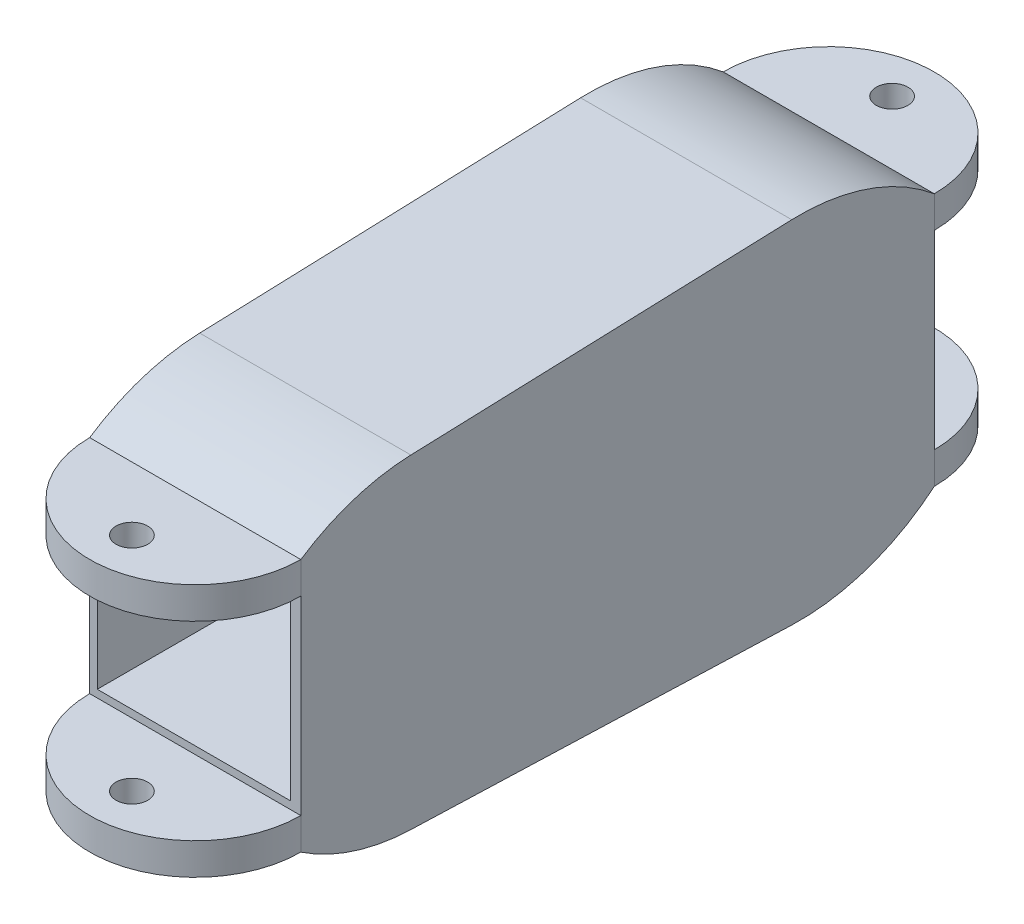
ISO-10303-21;
HEADER;
FILE_DESCRIPTION(('STEP AP214'),'2;1');
FILE_NAME('part.step','',(''),(''),'','','');
FILE_SCHEMA(('AUTOMOTIVE_DESIGN { 1 0 10303 214 1 1 1 1 }'));
ENDSEC;
DATA;
#1=APPLICATION_CONTEXT('core data for automotive mechanical design processes');
#2=APPLICATION_PROTOCOL_DEFINITION('international standard','automotive_design',2000,#1);
#3=PRODUCT_CONTEXT('',#1,'mechanical');
#4=PRODUCT('Part','Part','',(#3));
#5=PRODUCT_RELATED_PRODUCT_CATEGORY('part','',(#4));
#6=PRODUCT_DEFINITION_FORMATION('','',#4);
#7=PRODUCT_DEFINITION_CONTEXT('part definition',#1,'design');
#8=PRODUCT_DEFINITION('design','',#6,#7);
#9=PRODUCT_DEFINITION_SHAPE('','',#8);
#10=(LENGTH_UNIT() NAMED_UNIT(*) SI_UNIT(.MILLI.,.METRE.));
#11=(NAMED_UNIT(*) PLANE_ANGLE_UNIT() SI_UNIT($,.RADIAN.));
#12=(NAMED_UNIT(*) SI_UNIT($,.STERADIAN.) SOLID_ANGLE_UNIT());
#13=UNCERTAINTY_MEASURE_WITH_UNIT(LENGTH_MEASURE(1.E-05),#10,'distance_accuracy_value','');
#14=(GEOMETRIC_REPRESENTATION_CONTEXT(3) GLOBAL_UNCERTAINTY_ASSIGNED_CONTEXT((#13)) GLOBAL_UNIT_ASSIGNED_CONTEXT((#10,
#11,#12)) REPRESENTATION_CONTEXT('',''));
#15=CARTESIAN_POINT('',(0.,0.,0.));
#16=DIRECTION('',(0.,0.,1.));
#17=DIRECTION('',(1.,0.,0.));
#18=AXIS2_PLACEMENT_3D('',#15,#16,#17);
#19=CARTESIAN_POINT('',(0.,-6.,-15.));
#20=DIRECTION('',(0.,-1.,0.));
#21=DIRECTION('',(0.,0.,-1.));
#22=AXIS2_PLACEMENT_3D('',#19,#20,#21);
#23=PLANE('',#22);
#24=CARTESIAN_POINT('',(5.,-6.,18.));
#25=DIRECTION('',(0.,-1.,0.));
#26=DIRECTION('',(0.,0.,-1.));
#27=AXIS2_PLACEMENT_3D('',#24,#25,#26);
#28=CIRCLE('',#27,0.75);
#29=CARTESIAN_POINT('',(5.,-6.,17.25));
#30=VERTEX_POINT('',#29);
#31=EDGE_CURVE('E268',#30,#30,#28,.F.);
#32=ORIENTED_EDGE('',*,*,#31,.T.);
#33=EDGE_LOOP('',(#32));
#34=FACE_BOUND('',#33,.T.);
#35=DIRECTION('',(-1.,0.,0.));
#36=VECTOR('',#35,1.);
#37=CARTESIAN_POINT('',(0.,-6.,15.));
#38=LINE('',#37,#36);
#39=CARTESIAN_POINT('',(0.,-6.,15.));
#40=VERTEX_POINT('',#39);
#41=CARTESIAN_POINT('',(10.,-6.,15.));
#42=VERTEX_POINT('',#41);
#43=EDGE_CURVE('E266',#40,#42,#38,.F.);
#44=ORIENTED_EDGE('',*,*,#43,.T.);
#45=CARTESIAN_POINT('',(5.,-6.,15.));
#46=DIRECTION('',(0.,-1.,0.));
#47=DIRECTION('',(0.,0.,-1.));
#48=AXIS2_PLACEMENT_3D('',#45,#46,#47);
#49=CIRCLE('',#48,5.);
#50=EDGE_CURVE('E276',#40,#42,#49,.F.);
#51=ORIENTED_EDGE('',*,*,#50,.F.);
#52=EDGE_LOOP('',(#44,#51));
#53=FACE_BOUND('',#52,.T.);
#54=ADVANCED_FACE('F35',(#34,#53),#23,.T.);
#55=CARTESIAN_POINT('',(5.,-1.17017506795E-11,-15.));
#56=DIRECTION('',(0.,1.,0.));
#57=DIRECTION('',(0.,0.,1.));
#58=AXIS2_PLACEMENT_3D('',#55,#56,#57);
#59=CYLINDRICAL_SURFACE('',#58,5.);
#60=CARTESIAN_POINT('',(5.,-6.,-15.));
#61=DIRECTION('',(0.,1.,0.));
#62=DIRECTION('',(0.,0.,1.));
#63=AXIS2_PLACEMENT_3D('',#60,#61,#62);
#64=CIRCLE('',#63,5.);
#65=CARTESIAN_POINT('',(0.,-6.,-15.));
#66=VERTEX_POINT('',#65);
#67=CARTESIAN_POINT('',(10.,-6.,-15.));
#68=VERTEX_POINT('',#67);
#69=EDGE_CURVE('E282',#66,#68,#64,.F.);
#70=ORIENTED_EDGE('',*,*,#69,.F.);
#71=DIRECTION('',(0.,1.,0.));
#72=VECTOR('',#71,1.);
#73=CARTESIAN_POINT('',(0.,-1.17017506795E-11,-15.));
#74=LINE('',#73,#72);
#75=CARTESIAN_POINT('',(0.,-4.5,-15.));
#76=VERTEX_POINT('',#75);
#77=EDGE_CURVE('E289',#66,#76,#74,.T.);
#78=ORIENTED_EDGE('',*,*,#77,.T.);
#79=CARTESIAN_POINT('',(5.,-4.5,-15.));
#80=DIRECTION('',(0.,1.,0.));
#81=DIRECTION('',(0.,0.,1.));
#82=AXIS2_PLACEMENT_3D('',#79,#80,#81);
#83=CIRCLE('',#82,5.);
#84=CARTESIAN_POINT('',(10.,-4.5,-15.));
#85=VERTEX_POINT('',#84);
#86=EDGE_CURVE('E435',#85,#76,#83,.T.);
#87=ORIENTED_EDGE('',*,*,#86,.F.);
#88=DIRECTION('',(0.,1.,0.));
#89=VECTOR('',#88,1.);
#90=CARTESIAN_POINT('',(10.,5.39301936442E-12,-15.));
#91=LINE('',#90,#89);
#92=EDGE_CURVE('E183',#85,#68,#91,.F.);
#93=ORIENTED_EDGE('',*,*,#92,.T.);
#94=EDGE_LOOP('',(#70,#78,#87,#93));
#95=FACE_BOUND('',#94,.T.);
#96=ADVANCED_FACE('F398',(#95),#59,.T.);
#97=CARTESIAN_POINT('',(5.,4.,-18.));
#98=DIRECTION('',(0.,-1.,0.));
#99=DIRECTION('',(0.,0.,-1.));
#100=AXIS2_PLACEMENT_3D('',#97,#98,#99);
#101=CYLINDRICAL_SURFACE('',#100,0.75);
#102=CARTESIAN_POINT('',(5.,-6.,-18.));
#103=DIRECTION('',(0.,-1.,0.));
#104=DIRECTION('',(0.,0.,-1.));
#105=AXIS2_PLACEMENT_3D('',#102,#103,#104);
#106=CIRCLE('',#105,0.75);
#107=CARTESIAN_POINT('',(5.,-6.,-18.75));
#108=VERTEX_POINT('',#107);
#109=EDGE_CURVE('E438',#108,#108,#106,.F.);
#110=ORIENTED_EDGE('',*,*,#109,.F.);
#111=EDGE_LOOP('',(#110));
#112=FACE_BOUND('',#111,.T.);
#113=CARTESIAN_POINT('',(5.,-4.5,-18.));
#114=DIRECTION('',(0.,-1.,0.));
#115=DIRECTION('',(0.,0.,-1.));
#116=AXIS2_PLACEMENT_3D('',#113,#114,#115);
#117=CIRCLE('',#116,0.75);
#118=CARTESIAN_POINT('',(5.,-4.5,-18.75));
#119=VERTEX_POINT('',#118);
#120=EDGE_CURVE('E349',#119,#119,#117,.T.);
#121=ORIENTED_EDGE('',*,*,#120,.F.);
#122=EDGE_LOOP('',(#121));
#123=FACE_BOUND('',#122,.T.);
#124=ADVANCED_FACE('F395',(#112,#123),#101,.F.);
#125=CARTESIAN_POINT('',(5.,-1.17017506795E-11,-15.));
#126=DIRECTION('',(0.,1.,0.));
#127=DIRECTION('',(0.,0.,1.));
#128=AXIS2_PLACEMENT_3D('',#125,#126,#127);
#129=CYLINDRICAL_SURFACE('',#128,5.);
#130=CARTESIAN_POINT('',(5.,4.5,-15.));
#131=DIRECTION('',(0.,1.,0.));
#132=DIRECTION('',(0.,0.,1.));
#133=AXIS2_PLACEMENT_3D('',#130,#131,#132);
#134=CIRCLE('',#133,5.);
#135=CARTESIAN_POINT('',(10.,4.5,-15.));
#136=VERTEX_POINT('',#135);
#137=CARTESIAN_POINT('',(0.,4.5,-15.));
#138=VERTEX_POINT('',#137);
#139=EDGE_CURVE('E344',#136,#138,#134,.T.);
#140=ORIENTED_EDGE('',*,*,#139,.T.);
#141=DIRECTION('',(0.,1.,0.));
#142=VECTOR('',#141,1.);
#143=CARTESIAN_POINT('',(0.,-1.17017506795E-11,-15.));
#144=LINE('',#143,#142);
#145=CARTESIAN_POINT('',(0.,6.,-15.));
#146=VERTEX_POINT('',#145);
#147=EDGE_CURVE('E283',#138,#146,#144,.T.);
#148=ORIENTED_EDGE('',*,*,#147,.T.);
#149=CARTESIAN_POINT('',(5.,6.,-15.));
#150=DIRECTION('',(0.,1.,0.));
#151=DIRECTION('',(0.,0.,1.));
#152=AXIS2_PLACEMENT_3D('',#149,#150,#151);
#153=CIRCLE('',#152,5.);
#154=CARTESIAN_POINT('',(10.,6.,-15.));
#155=VERTEX_POINT('',#154);
#156=EDGE_CURVE('E425',#146,#155,#153,.F.);
#157=ORIENTED_EDGE('',*,*,#156,.T.);
#158=DIRECTION('',(0.,1.,0.));
#159=VECTOR('',#158,1.);
#160=CARTESIAN_POINT('',(10.,5.39301936442E-12,-15.));
#161=LINE('',#160,#159);
#162=EDGE_CURVE('E286',#155,#136,#161,.F.);
#163=ORIENTED_EDGE('',*,*,#162,.T.);
#164=EDGE_LOOP('',(#140,#148,#157,#163));
#165=FACE_BOUND('',#164,.T.);
#166=ADVANCED_FACE('F345',(#165),#129,.T.);
#167=CARTESIAN_POINT('',(5.,4.,-18.));
#168=DIRECTION('',(0.,-1.,0.));
#169=DIRECTION('',(0.,0.,-1.));
#170=AXIS2_PLACEMENT_3D('',#167,#168,#169);
#171=CYLINDRICAL_SURFACE('',#170,0.75);
#172=CARTESIAN_POINT('',(5.,6.,-18.));
#173=DIRECTION('',(0.,-1.,0.));
#174=DIRECTION('',(0.,0.,-1.));
#175=AXIS2_PLACEMENT_3D('',#172,#173,#174);
#176=CIRCLE('',#175,0.75);
#177=CARTESIAN_POINT('',(5.,6.,-18.75));
#178=VERTEX_POINT('',#177);
#179=EDGE_CURVE('E279',#178,#178,#176,.F.);
#180=ORIENTED_EDGE('',*,*,#179,.T.);
#181=EDGE_LOOP('',(#180));
#182=FACE_BOUND('',#181,.T.);
#183=CARTESIAN_POINT('',(5.,4.5,-18.));
#184=DIRECTION('',(0.,-1.,0.));
#185=DIRECTION('',(0.,0.,-1.));
#186=AXIS2_PLACEMENT_3D('',#183,#184,#185);
#187=CIRCLE('',#186,0.75);
#188=CARTESIAN_POINT('',(5.,4.5,-18.75));
#189=VERTEX_POINT('',#188);
#190=EDGE_CURVE('E348',#189,#189,#187,.T.);
#191=ORIENTED_EDGE('',*,*,#190,.T.);
#192=EDGE_LOOP('',(#191));
#193=FACE_BOUND('',#192,.T.);
#194=ADVANCED_FACE('F388',(#182,#193),#171,.F.);
#195=CARTESIAN_POINT('',(0.,6.,-15.));
#196=DIRECTION('',(0.,-1.,0.));
#197=DIRECTION('',(0.,0.,-1.));
#198=AXIS2_PLACEMENT_3D('',#195,#196,#197);
#199=PLANE('',#198);
#200=CARTESIAN_POINT('',(5.,6.,18.));
#201=DIRECTION('',(0.,-1.,0.));
#202=DIRECTION('',(0.,0.,-1.));
#203=AXIS2_PLACEMENT_3D('',#200,#201,#202);
#204=CIRCLE('',#203,0.75);
#205=CARTESIAN_POINT('',(5.,6.,17.25));
#206=VERTEX_POINT('',#205);
#207=EDGE_CURVE('E262',#206,#206,#204,.T.);
#208=ORIENTED_EDGE('',*,*,#207,.T.);
#209=EDGE_LOOP('',(#208));
#210=FACE_BOUND('',#209,.T.);
#211=CARTESIAN_POINT('',(5.,6.,15.));
#212=DIRECTION('',(0.,-1.,0.));
#213=DIRECTION('',(0.,0.,-1.));
#214=AXIS2_PLACEMENT_3D('',#211,#212,#213);
#215=CIRCLE('',#214,5.);
#216=CARTESIAN_POINT('',(10.,6.,15.));
#217=VERTEX_POINT('',#216);
#218=CARTESIAN_POINT('',(0.,6.,15.));
#219=VERTEX_POINT('',#218);
#220=EDGE_CURVE('E263',#217,#219,#215,.T.);
#221=ORIENTED_EDGE('',*,*,#220,.F.);
#222=DIRECTION('',(-1.,0.,0.));
#223=VECTOR('',#222,1.);
#224=CARTESIAN_POINT('',(0.,6.,15.));
#225=LINE('',#224,#223);
#226=EDGE_CURVE('E215',#217,#219,#225,.T.);
#227=ORIENTED_EDGE('',*,*,#226,.T.);
#228=EDGE_LOOP('',(#221,#227));
#229=FACE_BOUND('',#228,.T.);
#230=ADVANCED_FACE('F385',(#210,#229),#199,.F.);
#231=CARTESIAN_POINT('',(5.,-1.17017506795E-11,15.));
#232=DIRECTION('',(0.,-1.,0.));
#233=DIRECTION('',(0.,0.,-1.));
#234=AXIS2_PLACEMENT_3D('',#231,#232,#233);
#235=CYLINDRICAL_SURFACE('',#234,5.);
#236=CARTESIAN_POINT('',(5.,-4.5,15.));
#237=DIRECTION('',(0.,-1.,0.));
#238=DIRECTION('',(0.,0.,-1.));
#239=AXIS2_PLACEMENT_3D('',#236,#237,#238);
#240=CIRCLE('',#239,5.);
#241=CARTESIAN_POINT('',(0.,-4.5,15.));
#242=VERTEX_POINT('',#241);
#243=CARTESIAN_POINT('',(10.,-4.5,15.));
#244=VERTEX_POINT('',#243);
#245=EDGE_CURVE('E212',#242,#244,#240,.F.);
#246=ORIENTED_EDGE('',*,*,#245,.F.);
#247=DIRECTION('',(0.,-1.,0.));
#248=VECTOR('',#247,1.);
#249=CARTESIAN_POINT('',(0.,-1.17017506795E-11,15.));
#250=LINE('',#249,#248);
#251=EDGE_CURVE('E273',#242,#40,#250,.T.);
#252=ORIENTED_EDGE('',*,*,#251,.T.);
#253=ORIENTED_EDGE('',*,*,#50,.T.);
#254=DIRECTION('',(0.,1.,0.));
#255=VECTOR('',#254,1.);
#256=CARTESIAN_POINT('',(10.,0.,15.));
#257=LINE('',#256,#255);
#258=EDGE_CURVE('E213',#244,#42,#257,.F.);
#259=ORIENTED_EDGE('',*,*,#258,.F.);
#260=EDGE_LOOP('',(#246,#252,#253,#259));
#261=FACE_BOUND('',#260,.T.);
#262=ADVANCED_FACE('F312',(#261),#235,.T.);
#263=CARTESIAN_POINT('',(5.,4.,18.));
#264=DIRECTION('',(0.,-1.,0.));
#265=DIRECTION('',(0.,0.,-1.));
#266=AXIS2_PLACEMENT_3D('',#263,#264,#265);
#267=CYLINDRICAL_SURFACE('',#266,0.75);
#268=ORIENTED_EDGE('',*,*,#31,.F.);
#269=EDGE_LOOP('',(#268));
#270=FACE_BOUND('',#269,.T.);
#271=CARTESIAN_POINT('',(5.,-4.5,18.));
#272=DIRECTION('',(0.,-1.,0.));
#273=DIRECTION('',(0.,0.,-1.));
#274=AXIS2_PLACEMENT_3D('',#271,#272,#273);
#275=CIRCLE('',#274,0.75);
#276=CARTESIAN_POINT('',(5.,-4.5,17.25));
#277=VERTEX_POINT('',#276);
#278=EDGE_CURVE('E706',#277,#277,#275,.T.);
#279=ORIENTED_EDGE('',*,*,#278,.F.);
#280=EDGE_LOOP('',(#279));
#281=FACE_BOUND('',#280,.T.);
#282=ADVANCED_FACE('F379',(#270,#281),#267,.F.);
#283=CARTESIAN_POINT('',(5.,-1.17017506795E-11,15.));
#284=DIRECTION('',(0.,-1.,0.));
#285=DIRECTION('',(0.,0.,-1.));
#286=AXIS2_PLACEMENT_3D('',#283,#284,#285);
#287=CYLINDRICAL_SURFACE('',#286,5.);
#288=ORIENTED_EDGE('',*,*,#220,.T.);
#289=DIRECTION('',(0.,-1.,0.));
#290=VECTOR('',#289,1.);
#291=CARTESIAN_POINT('',(0.,-1.17017506795E-11,15.));
#292=LINE('',#291,#290);
#293=CARTESIAN_POINT('',(0.,4.5,15.));
#294=VERTEX_POINT('',#293);
#295=EDGE_CURVE('E257',#219,#294,#292,.T.);
#296=ORIENTED_EDGE('',*,*,#295,.T.);
#297=CARTESIAN_POINT('',(5.,4.5,15.));
#298=DIRECTION('',(0.,-1.,0.));
#299=DIRECTION('',(0.,0.,-1.));
#300=AXIS2_PLACEMENT_3D('',#297,#298,#299);
#301=CIRCLE('',#300,5.);
#302=CARTESIAN_POINT('',(10.,4.5,15.));
#303=VERTEX_POINT('',#302);
#304=EDGE_CURVE('E711',#294,#303,#301,.F.);
#305=ORIENTED_EDGE('',*,*,#304,.T.);
#306=DIRECTION('',(0.,1.,0.));
#307=VECTOR('',#306,1.);
#308=CARTESIAN_POINT('',(10.,0.,15.));
#309=LINE('',#308,#307);
#310=EDGE_CURVE('E209',#217,#303,#309,.F.);
#311=ORIENTED_EDGE('',*,*,#310,.F.);
#312=EDGE_LOOP('',(#288,#296,#305,#311));
#313=FACE_BOUND('',#312,.T.);
#314=ADVANCED_FACE('F375',(#313),#287,.T.);
#315=CARTESIAN_POINT('',(5.,4.,18.));
#316=DIRECTION('',(0.,-1.,0.));
#317=DIRECTION('',(0.,0.,-1.));
#318=AXIS2_PLACEMENT_3D('',#315,#316,#317);
#319=CYLINDRICAL_SURFACE('',#318,0.75);
#320=ORIENTED_EDGE('',*,*,#207,.F.);
#321=EDGE_LOOP('',(#320));
#322=FACE_BOUND('',#321,.T.);
#323=CARTESIAN_POINT('',(5.,4.5,18.));
#324=DIRECTION('',(0.,-1.,0.));
#325=DIRECTION('',(0.,0.,-1.));
#326=AXIS2_PLACEMENT_3D('',#323,#324,#325);
#327=CIRCLE('',#326,0.75);
#328=CARTESIAN_POINT('',(5.,4.5,17.25));
#329=VERTEX_POINT('',#328);
#330=EDGE_CURVE('E194',#329,#329,#327,.T.);
#331=ORIENTED_EDGE('',*,*,#330,.T.);
#332=EDGE_LOOP('',(#331));
#333=FACE_BOUND('',#332,.T.);
#334=ADVANCED_FACE('F371',(#322,#333),#319,.F.);
#335=CARTESIAN_POINT('',(0.,-6.,-15.));
#336=DIRECTION('',(0.,-1.,0.));
#337=DIRECTION('',(0.,0.,-1.));
#338=AXIS2_PLACEMENT_3D('',#335,#336,#337);
#339=PLANE('',#338);
#340=ORIENTED_EDGE('',*,*,#109,.T.);
#341=EDGE_LOOP('',(#340));
#342=FACE_BOUND('',#341,.T.);
#343=DIRECTION('',(-1.,0.,0.));
#344=VECTOR('',#343,1.);
#345=CARTESIAN_POINT('',(0.,-6.,-15.));
#346=LINE('',#345,#344);
#347=EDGE_CURVE('E193',#66,#68,#346,.F.);
#348=ORIENTED_EDGE('',*,*,#347,.F.);
#349=ORIENTED_EDGE('',*,*,#69,.T.);
#350=EDGE_LOOP('',(#348,#349));
#351=FACE_BOUND('',#350,.T.);
#352=ADVANCED_FACE('F363',(#342,#351),#339,.T.);
#353=CARTESIAN_POINT('',(0.,-4.5,-20.));
#354=DIRECTION('',(0.,1.,0.));
#355=DIRECTION('',(0.,0.,1.));
#356=AXIS2_PLACEMENT_3D('',#353,#354,#355);
#357=PLANE('',#356);
#358=ORIENTED_EDGE('',*,*,#120,.T.);
#359=EDGE_LOOP('',(#358));
#360=FACE_BOUND('',#359,.T.);
#361=DIRECTION('',(-1.,0.,0.));
#362=VECTOR('',#361,1.);
#363=CARTESIAN_POINT('',(0.,-4.5,-15.));
#364=LINE('',#363,#362);
#365=EDGE_CURVE('E328',#85,#76,#364,.T.);
#366=ORIENTED_EDGE('',*,*,#365,.F.);
#367=ORIENTED_EDGE('',*,*,#86,.T.);
#368=EDGE_LOOP('',(#366,#367));
#369=FACE_BOUND('',#368,.T.);
#370=ADVANCED_FACE('F354',(#360,#369),#357,.T.);
#371=CARTESIAN_POINT('',(0.,4.5,-20.));
#372=DIRECTION('',(0.,1.,0.));
#373=DIRECTION('',(0.,0.,1.));
#374=AXIS2_PLACEMENT_3D('',#371,#372,#373);
#375=PLANE('',#374);
#376=ORIENTED_EDGE('',*,*,#190,.F.);
#377=EDGE_LOOP('',(#376));
#378=FACE_BOUND('',#377,.T.);
#379=ORIENTED_EDGE('',*,*,#139,.F.);
#380=DIRECTION('',(-1.,0.,0.));
#381=VECTOR('',#380,1.);
#382=CARTESIAN_POINT('',(0.,4.5,-15.));
#383=LINE('',#382,#381);
#384=EDGE_CURVE('E222',#138,#136,#383,.F.);
#385=ORIENTED_EDGE('',*,*,#384,.F.);
#386=EDGE_LOOP('',(#379,#385));
#387=FACE_BOUND('',#386,.T.);
#388=ADVANCED_FACE('F351',(#378,#387),#375,.F.);
#389=CARTESIAN_POINT('',(0.,6.,-15.));
#390=DIRECTION('',(0.,-1.,0.));
#391=DIRECTION('',(0.,0.,-1.));
#392=AXIS2_PLACEMENT_3D('',#389,#390,#391);
#393=PLANE('',#392);
#394=ORIENTED_EDGE('',*,*,#179,.F.);
#395=EDGE_LOOP('',(#394));
#396=FACE_BOUND('',#395,.T.);
#397=DIRECTION('',(-1.,0.,0.));
#398=VECTOR('',#397,1.);
#399=CARTESIAN_POINT('',(0.,6.,-15.));
#400=LINE('',#399,#398);
#401=EDGE_CURVE('E216',#155,#146,#400,.T.);
#402=ORIENTED_EDGE('',*,*,#401,.F.);
#403=ORIENTED_EDGE('',*,*,#156,.F.);
#404=EDGE_LOOP('',(#402,#403));
#405=FACE_BOUND('',#404,.T.);
#406=ADVANCED_FACE('F353',(#396,#405),#393,.F.);
#407=CARTESIAN_POINT('',(10.,0.,0.));
#408=DIRECTION('',(1.,0.,0.));
#409=DIRECTION('',(0.,0.,-1.));
#410=AXIS2_PLACEMENT_3D('',#407,#408,#409);
#411=PLANE('',#410);
#412=DIRECTION('',(0.,0.0348994967025033,-0.999390827019096));
#413=VECTOR('',#412,1.);
#414=CARTESIAN_POINT('',(10.,7.5,15.));
#415=LINE('',#414,#413);
#416=CARTESIAN_POINT('',(10.,8.31187122865555,-8.2489501368906));
#417=VERTEX_POINT('',#416);
#418=CARTESIAN_POINT('',(10.,7.68196607813639,9.78917329758786));
#419=VERTEX_POINT('',#418);
#420=EDGE_CURVE('E206',#417,#419,#415,.F.);
#421=ORIENTED_EDGE('',*,*,#420,.T.);
#422=CARTESIAN_POINT('',(10.,-2.31194219205457,9.44017833056283));
#423=DIRECTION('',(1.,0.,0.));
#424=DIRECTION('',(0.,0.,-1.));
#425=AXIS2_PLACEMENT_3D('',#422,#423,#424);
#426=CIRCLE('',#425,10.);
#427=EDGE_CURVE('E239',#419,#217,#426,.T.);
#428=ORIENTED_EDGE('',*,*,#427,.T.);
#429=ORIENTED_EDGE('',*,*,#310,.T.);
#430=DIRECTION('',(0.,1.,0.));
#431=VECTOR('',#430,1.);
#432=CARTESIAN_POINT('',(10.,6.,15.));
#433=LINE('',#432,#431);
#434=EDGE_CURVE('E203',#303,#244,#433,.F.);
#435=ORIENTED_EDGE('',*,*,#434,.T.);
#436=ORIENTED_EDGE('',*,*,#258,.T.);
#437=CARTESIAN_POINT('',(10.,2.31194219205457,9.44017833056283));
#438=DIRECTION('',(1.,0.,0.));
#439=DIRECTION('',(0.,0.,-1.));
#440=AXIS2_PLACEMENT_3D('',#437,#438,#439);
#441=CIRCLE('',#440,10.);
#442=CARTESIAN_POINT('',(10.,-7.68196607813639,9.78917329758786));
#443=VERTEX_POINT('',#442);
#444=EDGE_CURVE('E50',#42,#443,#441,.T.);
#445=ORIENTED_EDGE('',*,*,#444,.T.);
#446=DIRECTION('',(0.,-0.0348994967025033,-0.999390827019096));
#447=VECTOR('',#446,1.);
#448=CARTESIAN_POINT('',(10.,-7.5,15.));
#449=LINE('',#448,#447);
#450=CARTESIAN_POINT('',(10.,-8.31187122865555,-8.24895013689059));
#451=VERTEX_POINT('',#450);
#452=EDGE_CURVE('E191',#451,#443,#449,.F.);
#453=ORIENTED_EDGE('',*,*,#452,.F.);
#454=CARTESIAN_POINT('',(10.,1.68203704153541,-8.59794510391563));
#455=DIRECTION('',(1.,0.,0.));
#456=DIRECTION('',(0.,0.,-1.));
#457=AXIS2_PLACEMENT_3D('',#454,#455,#456);
#458=CIRCLE('',#457,10.);
#459=EDGE_CURVE('E236',#451,#68,#458,.T.);
#460=ORIENTED_EDGE('',*,*,#459,.T.);
#461=ORIENTED_EDGE('',*,*,#92,.F.);
#462=DIRECTION('',(0.,1.,0.));
#463=VECTOR('',#462,1.);
#464=CARTESIAN_POINT('',(10.,-7.5,-15.));
#465=LINE('',#464,#463);
#466=EDGE_CURVE('E219',#136,#85,#465,.F.);
#467=ORIENTED_EDGE('',*,*,#466,.F.);
#468=ORIENTED_EDGE('',*,*,#162,.F.);
#469=CARTESIAN_POINT('',(10.,-1.68203704153541,-8.59794510391563));
#470=DIRECTION('',(1.,0.,0.));
#471=DIRECTION('',(0.,0.,-1.));
#472=AXIS2_PLACEMENT_3D('',#469,#470,#471);
#473=CIRCLE('',#472,10.);
#474=EDGE_CURVE('E234',#155,#417,#473,.T.);
#475=ORIENTED_EDGE('',*,*,#474,.T.);
#476=EDGE_LOOP('',(#421,#428,#429,#435,#436,#445,#453,#460,#461,#467,#468,#475));
#477=FACE_BOUND('',#476,.T.);
#478=ADVANCED_FACE('F319',(#477),#411,.T.);
#479=CARTESIAN_POINT('',(0.,-4.5,-20.));
#480=DIRECTION('',(0.,1.,0.));
#481=DIRECTION('',(0.,0.,1.));
#482=AXIS2_PLACEMENT_3D('',#479,#480,#481);
#483=PLANE('',#482);
#484=ORIENTED_EDGE('',*,*,#278,.T.);
#485=EDGE_LOOP('',(#484));
#486=FACE_BOUND('',#485,.T.);
#487=DIRECTION('',(-1.,0.,0.));
#488=VECTOR('',#487,1.);
#489=CARTESIAN_POINT('',(0.,-4.5,15.));
#490=LINE('',#489,#488);
#491=EDGE_CURVE('E202',#244,#242,#490,.T.);
#492=ORIENTED_EDGE('',*,*,#491,.T.);
#493=ORIENTED_EDGE('',*,*,#245,.T.);
#494=EDGE_LOOP('',(#492,#493));
#495=FACE_BOUND('',#494,.T.);
#496=ADVANCED_FACE('F494',(#486,#495),#483,.T.);
#497=CARTESIAN_POINT('',(0.,4.5,-20.));
#498=DIRECTION('',(0.,1.,0.));
#499=DIRECTION('',(0.,0.,1.));
#500=AXIS2_PLACEMENT_3D('',#497,#498,#499);
#501=PLANE('',#500);
#502=ORIENTED_EDGE('',*,*,#330,.F.);
#503=EDGE_LOOP('',(#502));
#504=FACE_BOUND('',#503,.T.);
#505=DIRECTION('',(-1.,0.,0.));
#506=VECTOR('',#505,1.);
#507=CARTESIAN_POINT('',(0.,4.5,15.));
#508=LINE('',#507,#506);
#509=EDGE_CURVE('E198',#294,#303,#508,.F.);
#510=ORIENTED_EDGE('',*,*,#509,.T.);
#511=ORIENTED_EDGE('',*,*,#304,.F.);
#512=EDGE_LOOP('',(#510,#511));
#513=FACE_BOUND('',#512,.T.);
#514=ADVANCED_FACE('F491',(#504,#513),#501,.F.);
#515=CARTESIAN_POINT('',(5.,-7.5,15.));
#516=DIRECTION('',(0.,-0.999390827019096,0.0348994967025033));
#517=DIRECTION('',(0.,-0.0348994967025033,-0.999390827019096));
#518=AXIS2_PLACEMENT_3D('',#515,#516,#517);
#519=PLANE('',#518);
#520=ORIENTED_EDGE('',*,*,#452,.T.);
#521=DIRECTION('',(1.,0.,0.));
#522=VECTOR('',#521,1.);
#523=CARTESIAN_POINT('',(0.,-7.68196607813639,9.78917329758786));
#524=LINE('',#523,#522);
#525=CARTESIAN_POINT('',(0.,-7.68196607813922,9.78917329759379));
#526=VERTEX_POINT('',#525);
#527=EDGE_CURVE('E242',#443,#526,#524,.F.);
#528=ORIENTED_EDGE('',*,*,#527,.T.);
#529=DIRECTION('',(0.,-0.0348994967030855,-0.999390827019075));
#530=VECTOR('',#529,1.);
#531=CARTESIAN_POINT('',(0.,-7.5,15.));
#532=LINE('',#531,#530);
#533=CARTESIAN_POINT('',(0.,-8.31187122866909,-8.24895013689012));
#534=VERTEX_POINT('',#533);
#535=EDGE_CURVE('E201',#526,#534,#532,.T.);
#536=ORIENTED_EDGE('',*,*,#535,.T.);
#537=DIRECTION('',(1.,0.,0.));
#538=VECTOR('',#537,1.);
#539=CARTESIAN_POINT('',(10.,-8.31187122865555,-8.24895013689059));
#540=LINE('',#539,#538);
#541=EDGE_CURVE('E57',#534,#451,#540,.T.);
#542=ORIENTED_EDGE('',*,*,#541,.T.);
#543=EDGE_LOOP('',(#520,#528,#536,#542));
#544=FACE_BOUND('',#543,.T.);
#545=ADVANCED_FACE('F317',(#544),#519,.T.);
#546=CARTESIAN_POINT('',(0.,-7.5,-15.));
#547=DIRECTION('',(0.,0.,-1.));
#548=DIRECTION('',(-1.,0.,0.));
#549=AXIS2_PLACEMENT_3D('',#546,#547,#548);
#550=PLANE('',#549);
#551=DIRECTION('',(0.,1.,0.));
#552=VECTOR('',#551,1.);
#553=CARTESIAN_POINT('',(0.360591879251198,4.08493622879003,-15.));
#554=LINE('',#553,#552);
#555=CARTESIAN_POINT('',(0.360591879251198,-4.14030924425044,-15.));
#556=VERTEX_POINT('',#555);
#557=CARTESIAN_POINT('',(0.360591879251198,4.08493622879003,-15.));
#558=VERTEX_POINT('',#557);
#559=EDGE_CURVE('E171',#556,#558,#554,.T.);
#560=ORIENTED_EDGE('',*,*,#559,.F.);
#561=DIRECTION('',(-1.,0.,0.));
#562=VECTOR('',#561,1.);
#563=CARTESIAN_POINT('',(0.360591879251198,-4.14030924425044,-15.));
#564=LINE('',#563,#562);
#565=CARTESIAN_POINT('',(9.51002223690302,-4.14030924425044,-15.));
#566=VERTEX_POINT('',#565);
#567=EDGE_CURVE('E176',#566,#556,#564,.T.);
#568=ORIENTED_EDGE('',*,*,#567,.F.);
#569=DIRECTION('',(0.,-1.,0.));
#570=VECTOR('',#569,1.);
#571=CARTESIAN_POINT('',(9.51002223690302,4.08493622879003,-15.));
#572=LINE('',#571,#570);
#573=CARTESIAN_POINT('',(9.51002223690302,4.08493622879003,-15.));
#574=VERTEX_POINT('',#573);
#575=EDGE_CURVE('E155',#574,#566,#572,.T.);
#576=ORIENTED_EDGE('',*,*,#575,.F.);
#577=DIRECTION('',(1.,0.,0.));
#578=VECTOR('',#577,1.);
#579=CARTESIAN_POINT('',(0.360591879251198,4.08493622879003,-15.));
#580=LINE('',#579,#578);
#581=EDGE_CURVE('E166',#558,#574,#580,.T.);
#582=ORIENTED_EDGE('',*,*,#581,.F.);
#583=EDGE_LOOP('',(#560,#568,#576,#582));
#584=FACE_BOUND('',#583,.T.);
#585=ORIENTED_EDGE('',*,*,#384,.T.);
#586=ORIENTED_EDGE('',*,*,#466,.T.);
#587=ORIENTED_EDGE('',*,*,#365,.T.);
#588=DIRECTION('',(0.,1.,0.));
#589=VECTOR('',#588,1.);
#590=CARTESIAN_POINT('',(0.,0.,-15.));
#591=LINE('',#590,#589);
#592=EDGE_CURVE('E190',#76,#138,#591,.T.);
#593=ORIENTED_EDGE('',*,*,#592,.T.);
#594=EDGE_LOOP('',(#585,#586,#587,#593));
#595=FACE_BOUND('',#594,.T.);
#596=ADVANCED_FACE('F173',(#584,#595),#550,.T.);
#597=CARTESIAN_POINT('',(5.,7.5,15.));
#598=DIRECTION('',(0.,-0.999390827019096,-0.0348994967025033));
#599=DIRECTION('',(0.,0.0348994967025033,-0.999390827019096));
#600=AXIS2_PLACEMENT_3D('',#597,#598,#599);
#601=PLANE('',#600);
#602=DIRECTION('',(0.,-0.0348994967020874,0.99939082701911));
#603=VECTOR('',#602,1.);
#604=CARTESIAN_POINT('',(0.,8.54762308474,-15.));
#605=LINE('',#604,#603);
#606=CARTESIAN_POINT('',(0.,8.31187122864602,-8.24895013689509));
#607=VERTEX_POINT('',#606);
#608=CARTESIAN_POINT('',(0.,7.68196607813422,9.78917329758778));
#609=VERTEX_POINT('',#608);
#610=EDGE_CURVE('E186',#607,#609,#605,.T.);
#611=ORIENTED_EDGE('',*,*,#610,.T.);
#612=DIRECTION('',(-1.,0.,0.));
#613=VECTOR('',#612,1.);
#614=CARTESIAN_POINT('',(5.,7.68196607813639,9.78917329758786));
#615=LINE('',#614,#613);
#616=EDGE_CURVE('E232',#609,#419,#615,.F.);
#617=ORIENTED_EDGE('',*,*,#616,.T.);
#618=ORIENTED_EDGE('',*,*,#420,.F.);
#619=DIRECTION('',(-1.,0.,0.));
#620=VECTOR('',#619,1.);
#621=CARTESIAN_POINT('',(5.,8.31187122865555,-8.2489501368906));
#622=LINE('',#621,#620);
#623=EDGE_CURVE('E230',#417,#607,#622,.T.);
#624=ORIENTED_EDGE('',*,*,#623,.T.);
#625=EDGE_LOOP('',(#611,#617,#618,#624));
#626=FACE_BOUND('',#625,.T.);
#627=ADVANCED_FACE('F483',(#626),#601,.F.);
#628=CARTESIAN_POINT('',(0.,6.,15.));
#629=DIRECTION('',(0.,0.,-1.));
#630=DIRECTION('',(-1.,0.,0.));
#631=AXIS2_PLACEMENT_3D('',#628,#629,#630);
#632=PLANE('',#631);
#633=DIRECTION('',(-1.,0.,0.));
#634=VECTOR('',#633,1.);
#635=CARTESIAN_POINT('',(0.,-4.14030924425044,15.));
#636=LINE('',#635,#634);
#637=CARTESIAN_POINT('',(9.51002223690302,-4.14030924425044,15.));
#638=VERTEX_POINT('',#637);
#639=CARTESIAN_POINT('',(0.360591879251198,-4.14030924425044,15.));
#640=VERTEX_POINT('',#639);
#641=EDGE_CURVE('E445',#638,#640,#636,.T.);
#642=ORIENTED_EDGE('',*,*,#641,.T.);
#643=DIRECTION('',(0.,1.,0.));
#644=VECTOR('',#643,1.);
#645=CARTESIAN_POINT('',(0.360591879251198,6.,15.));
#646=LINE('',#645,#644);
#647=CARTESIAN_POINT('',(0.360591879251198,4.08493622879003,15.));
#648=VERTEX_POINT('',#647);
#649=EDGE_CURVE('E299',#640,#648,#646,.T.);
#650=ORIENTED_EDGE('',*,*,#649,.T.);
#651=DIRECTION('',(1.,0.,0.));
#652=VECTOR('',#651,1.);
#653=CARTESIAN_POINT('',(0.,4.08493622879003,15.));
#654=LINE('',#653,#652);
#655=CARTESIAN_POINT('',(9.51002223690302,4.08493622879003,15.));
#656=VERTEX_POINT('',#655);
#657=EDGE_CURVE('E197',#648,#656,#654,.T.);
#658=ORIENTED_EDGE('',*,*,#657,.T.);
#659=DIRECTION('',(0.,-1.,0.));
#660=VECTOR('',#659,1.);
#661=CARTESIAN_POINT('',(9.51002223690302,6.,15.));
#662=LINE('',#661,#660);
#663=EDGE_CURVE('E158',#656,#638,#662,.T.);
#664=ORIENTED_EDGE('',*,*,#663,.T.);
#665=EDGE_LOOP('',(#642,#650,#658,#664));
#666=FACE_BOUND('',#665,.T.);
#667=DIRECTION('',(0.,1.,0.));
#668=VECTOR('',#667,1.);
#669=CARTESIAN_POINT('',(0.,0.,15.));
#670=LINE('',#669,#668);
#671=EDGE_CURVE('E189',#294,#242,#670,.F.);
#672=ORIENTED_EDGE('',*,*,#671,.T.);
#673=ORIENTED_EDGE('',*,*,#491,.F.);
#674=ORIENTED_EDGE('',*,*,#434,.F.);
#675=ORIENTED_EDGE('',*,*,#509,.F.);
#676=EDGE_LOOP('',(#672,#673,#674,#675));
#677=FACE_BOUND('',#676,.T.);
#678=ADVANCED_FACE('F253',(#666,#677),#632,.F.);
#679=CARTESIAN_POINT('',(0.,0.,0.));
#680=DIRECTION('',(1.,0.,0.));
#681=DIRECTION('',(0.,0.,-1.));
#682=AXIS2_PLACEMENT_3D('',#679,#680,#681);
#683=PLANE('',#682);
#684=CARTESIAN_POINT('',(0.,0.,0.));
#685=DIRECTION('',(1.,0.,0.));
#686=DIRECTION('',(0.,0.,-1.));
#687=AXIS2_PLACEMENT_3D('',#684,#685,#686);
#688=CIRCLE('',#687,2.03313572854289);
#689=CARTESIAN_POINT('',(0.,0.,-2.03313572854289));
#690=VERTEX_POINT('',#689);
#691=EDGE_CURVE('E43',#690,#690,#688,.F.);
#692=ORIENTED_EDGE('',*,*,#691,.F.);
#693=EDGE_LOOP('',(#692));
#694=FACE_BOUND('',#693,.T.);
#695=ORIENTED_EDGE('',*,*,#295,.F.);
#696=CARTESIAN_POINT('',(0.,-2.31194219205457,9.44017833056283));
#697=DIRECTION('',(1.,0.,0.));
#698=DIRECTION('',(0.,0.,-1.));
#699=AXIS2_PLACEMENT_3D('',#696,#697,#698);
#700=CIRCLE('',#699,10.);
#701=EDGE_CURVE('E228',#219,#609,#700,.F.);
#702=ORIENTED_EDGE('',*,*,#701,.T.);
#703=ORIENTED_EDGE('',*,*,#610,.F.);
#704=CARTESIAN_POINT('',(0.,-1.68203704153541,-8.59794510391563));
#705=DIRECTION('',(1.,0.,0.));
#706=DIRECTION('',(0.,0.,-1.));
#707=AXIS2_PLACEMENT_3D('',#704,#705,#706);
#708=CIRCLE('',#707,10.);
#709=EDGE_CURVE('E301',#607,#146,#708,.F.);
#710=ORIENTED_EDGE('',*,*,#709,.T.);
#711=ORIENTED_EDGE('',*,*,#147,.F.);
#712=ORIENTED_EDGE('',*,*,#592,.F.);
#713=ORIENTED_EDGE('',*,*,#77,.F.);
#714=CARTESIAN_POINT('',(0.,1.68203704153541,-8.59794510391563));
#715=DIRECTION('',(1.,0.,0.));
#716=DIRECTION('',(0.,0.,-1.));
#717=AXIS2_PLACEMENT_3D('',#714,#715,#716);
#718=CIRCLE('',#717,10.);
#719=EDGE_CURVE('E303',#66,#534,#718,.F.);
#720=ORIENTED_EDGE('',*,*,#719,.T.);
#721=ORIENTED_EDGE('',*,*,#535,.F.);
#722=CARTESIAN_POINT('',(0.,2.31194219205457,9.44017833056283));
#723=DIRECTION('',(1.,0.,0.));
#724=DIRECTION('',(0.,0.,-1.));
#725=AXIS2_PLACEMENT_3D('',#722,#723,#724);
#726=CIRCLE('',#725,10.);
#727=EDGE_CURVE('E304',#526,#40,#726,.F.);
#728=ORIENTED_EDGE('',*,*,#727,.T.);
#729=ORIENTED_EDGE('',*,*,#251,.F.);
#730=ORIENTED_EDGE('',*,*,#671,.F.);
#731=EDGE_LOOP('',(#695,#702,#703,#710,#711,#712,#713,#720,#721,#728,#729,#730));
#732=FACE_BOUND('',#731,.T.);
#733=ADVANCED_FACE('F249',(#694,#732),#683,.F.);
#734=CARTESIAN_POINT('',(0.360591879251198,4.08493622879003,23.));
#735=DIRECTION('',(-1.,0.,0.));
#736=DIRECTION('',(0.,0.,1.));
#737=AXIS2_PLACEMENT_3D('',#734,#735,#736);
#738=PLANE('',#737);
#739=DIRECTION('',(0.,0.,-1.));
#740=VECTOR('',#739,1.);
#741=CARTESIAN_POINT('',(0.360591879251198,-4.14030924425044,23.));
#742=LINE('',#741,#740);
#743=EDGE_CURVE('E181',#640,#556,#742,.T.);
#744=ORIENTED_EDGE('',*,*,#743,.T.);
#745=ORIENTED_EDGE('',*,*,#559,.T.);
#746=DIRECTION('',(0.,0.,-1.));
#747=VECTOR('',#746,1.);
#748=CARTESIAN_POINT('',(0.360591879251198,4.08493622879003,23.));
#749=LINE('',#748,#747);
#750=EDGE_CURVE('E162',#648,#558,#749,.T.);
#751=ORIENTED_EDGE('',*,*,#750,.F.);
#752=ORIENTED_EDGE('',*,*,#649,.F.);
#753=EDGE_LOOP('',(#744,#745,#751,#752));
#754=FACE_BOUND('',#753,.T.);
#755=ADVANCED_FACE('F252',(#754),#738,.F.);
#756=CARTESIAN_POINT('',(0.360591879251198,-4.14030924425044,23.));
#757=DIRECTION('',(0.,-1.,0.));
#758=DIRECTION('',(0.,0.,-1.));
#759=AXIS2_PLACEMENT_3D('',#756,#757,#758);
#760=PLANE('',#759);
#761=DIRECTION('',(0.,0.,-1.));
#762=VECTOR('',#761,1.);
#763=CARTESIAN_POINT('',(9.51002223690302,-4.14030924425044,23.));
#764=LINE('',#763,#762);
#765=EDGE_CURVE('E161',#638,#566,#764,.T.);
#766=ORIENTED_EDGE('',*,*,#765,.T.);
#767=ORIENTED_EDGE('',*,*,#567,.T.);
#768=ORIENTED_EDGE('',*,*,#743,.F.);
#769=ORIENTED_EDGE('',*,*,#641,.F.);
#770=EDGE_LOOP('',(#766,#767,#768,#769));
#771=FACE_BOUND('',#770,.T.);
#772=ADVANCED_FACE('F453',(#771),#760,.F.);
#773=CARTESIAN_POINT('',(9.51002223690302,4.08493622879003,23.));
#774=DIRECTION('',(1.,0.,0.));
#775=DIRECTION('',(0.,0.,-1.));
#776=AXIS2_PLACEMENT_3D('',#773,#774,#775);
#777=PLANE('',#776);
#778=CARTESIAN_POINT('',(9.51002223690302,0.,0.188198750493029));
#779=DIRECTION('',(1.,0.,0.));
#780=DIRECTION('',(0.,0.,-1.));
#781=AXIS2_PLACEMENT_3D('',#778,#779,#780);
#782=CIRCLE('',#781,2.);
#783=CARTESIAN_POINT('',(9.51002223690302,0.,-1.81180124950697));
#784=VERTEX_POINT('',#783);
#785=EDGE_CURVE('E11',#784,#784,#782,.F.);
#786=ORIENTED_EDGE('',*,*,#785,.F.);
#787=EDGE_LOOP('',(#786));
#788=FACE_BOUND('',#787,.T.);
#789=DIRECTION('',(0.,0.,-1.));
#790=VECTOR('',#789,1.);
#791=CARTESIAN_POINT('',(9.51002223690302,4.08493622879003,23.));
#792=LINE('',#791,#790);
#793=EDGE_CURVE('E150',#656,#574,#792,.T.);
#794=ORIENTED_EDGE('',*,*,#793,.T.);
#795=ORIENTED_EDGE('',*,*,#575,.T.);
#796=ORIENTED_EDGE('',*,*,#765,.F.);
#797=ORIENTED_EDGE('',*,*,#663,.F.);
#798=EDGE_LOOP('',(#794,#795,#796,#797));
#799=FACE_BOUND('',#798,.T.);
#800=ADVANCED_FACE('F152',(#788,#799),#777,.F.);
#801=CARTESIAN_POINT('',(0.360591879251198,4.08493622879003,23.));
#802=DIRECTION('',(0.,1.,0.));
#803=DIRECTION('',(0.,0.,1.));
#804=AXIS2_PLACEMENT_3D('',#801,#802,#803);
#805=PLANE('',#804);
#806=ORIENTED_EDGE('',*,*,#750,.T.);
#807=ORIENTED_EDGE('',*,*,#581,.T.);
#808=ORIENTED_EDGE('',*,*,#793,.F.);
#809=ORIENTED_EDGE('',*,*,#657,.F.);
#810=EDGE_LOOP('',(#806,#807,#808,#809));
#811=FACE_BOUND('',#810,.T.);
#812=ADVANCED_FACE('F167',(#811),#805,.F.);
#813=CARTESIAN_POINT('',(0.,-2.31194219205457,9.44017833056283));
#814=DIRECTION('',(-1.,0.,0.));
#815=DIRECTION('',(0.,0.,1.));
#816=AXIS2_PLACEMENT_3D('',#813,#814,#815);
#817=CYLINDRICAL_SURFACE('',#816,10.);
#818=ORIENTED_EDGE('',*,*,#427,.F.);
#819=ORIENTED_EDGE('',*,*,#616,.F.);
#820=ORIENTED_EDGE('',*,*,#701,.F.);
#821=ORIENTED_EDGE('',*,*,#226,.F.);
#822=EDGE_LOOP('',(#818,#819,#820,#821));
#823=FACE_BOUND('',#822,.T.);
#824=ADVANCED_FACE('F406',(#823),#817,.T.);
#825=CARTESIAN_POINT('',(0.,2.31194219205457,9.44017833056283));
#826=DIRECTION('',(-1.,0.,0.));
#827=DIRECTION('',(0.,0.,1.));
#828=AXIS2_PLACEMENT_3D('',#825,#826,#827);
#829=CYLINDRICAL_SURFACE('',#828,10.);
#830=ORIENTED_EDGE('',*,*,#444,.F.);
#831=ORIENTED_EDGE('',*,*,#43,.F.);
#832=ORIENTED_EDGE('',*,*,#727,.F.);
#833=ORIENTED_EDGE('',*,*,#527,.F.);
#834=EDGE_LOOP('',(#830,#831,#832,#833));
#835=FACE_BOUND('',#834,.T.);
#836=ADVANCED_FACE('F316',(#835),#829,.T.);
#837=CARTESIAN_POINT('',(0.,1.68203704153541,-8.59794510391563));
#838=DIRECTION('',(-1.,0.,0.));
#839=DIRECTION('',(0.,0.,1.));
#840=AXIS2_PLACEMENT_3D('',#837,#838,#839);
#841=CYLINDRICAL_SURFACE('',#840,10.);
#842=ORIENTED_EDGE('',*,*,#459,.F.);
#843=ORIENTED_EDGE('',*,*,#541,.F.);
#844=ORIENTED_EDGE('',*,*,#719,.F.);
#845=ORIENTED_EDGE('',*,*,#347,.T.);
#846=EDGE_LOOP('',(#842,#843,#844,#845));
#847=FACE_BOUND('',#846,.T.);
#848=ADVANCED_FACE('F324',(#847),#841,.T.);
#849=CARTESIAN_POINT('',(0.,-1.68203704153541,-8.59794510391563));
#850=DIRECTION('',(-1.,0.,0.));
#851=DIRECTION('',(0.,0.,1.));
#852=AXIS2_PLACEMENT_3D('',#849,#850,#851);
#853=CYLINDRICAL_SURFACE('',#852,10.);
#854=ORIENTED_EDGE('',*,*,#709,.F.);
#855=ORIENTED_EDGE('',*,*,#623,.F.);
#856=ORIENTED_EDGE('',*,*,#474,.F.);
#857=ORIENTED_EDGE('',*,*,#401,.T.);
#858=EDGE_LOOP('',(#854,#855,#856,#857));
#859=FACE_BOUND('',#858,.T.);
#860=ADVANCED_FACE('F37',(#859),#853,.T.);
#861=CARTESIAN_POINT('',(-3.,0.,0.));
#862=DIRECTION('',(1.,0.,0.));
#863=DIRECTION('',(0.,0.,-1.));
#864=AXIS2_PLACEMENT_3D('',#861,#862,#863);
#865=CYLINDRICAL_SURFACE('',#864,2.03313572854289);
#866=CARTESIAN_POINT('',(-3.,0.,0.));
#867=DIRECTION('',(-1.,0.,0.));
#868=DIRECTION('',(0.,0.,1.));
#869=AXIS2_PLACEMENT_3D('',#866,#867,#868);
#870=CIRCLE('',#869,2.03313572854289);
#871=CARTESIAN_POINT('',(-3.,0.,2.03313572854289));
#872=VERTEX_POINT('',#871);
#873=EDGE_CURVE('E454',#872,#872,#870,.T.);
#874=ORIENTED_EDGE('',*,*,#873,.F.);
#875=EDGE_LOOP('',(#874));
#876=FACE_BOUND('',#875,.T.);
#877=ORIENTED_EDGE('',*,*,#691,.T.);
#878=EDGE_LOOP('',(#877));
#879=FACE_BOUND('',#878,.T.);
#880=ADVANCED_FACE('F247',(#876,#879),#865,.T.);
#881=CARTESIAN_POINT('',(-3.,0.,0.));
#882=DIRECTION('',(-1.,0.,0.));
#883=DIRECTION('',(0.,0.,1.));
#884=AXIS2_PLACEMENT_3D('',#881,#882,#883);
#885=PLANE('',#884);
#886=ORIENTED_EDGE('',*,*,#873,.T.);
#887=EDGE_LOOP('',(#886));
#888=FACE_BOUND('',#887,.T.);
#889=ADVANCED_FACE('F419',(#888),#885,.T.);
#890=CARTESIAN_POINT('',(6.51002223690302,0.,0.188198750493029));
#891=DIRECTION('',(1.,0.,0.));
#892=DIRECTION('',(0.,0.,-1.));
#893=AXIS2_PLACEMENT_3D('',#890,#891,#892);
#894=CYLINDRICAL_SURFACE('',#893,2.);
#895=CARTESIAN_POINT('',(6.51002223690302,0.,0.188198750493029));
#896=DIRECTION('',(-1.,0.,0.));
#897=DIRECTION('',(0.,0.,1.));
#898=AXIS2_PLACEMENT_3D('',#895,#896,#897);
#899=CIRCLE('',#898,2.);
#900=CARTESIAN_POINT('',(6.51002223690302,0.,2.18819875049303));
#901=VERTEX_POINT('',#900);
#902=EDGE_CURVE('E456',#901,#901,#899,.T.);
#903=ORIENTED_EDGE('',*,*,#902,.F.);
#904=EDGE_LOOP('',(#903));
#905=FACE_BOUND('',#904,.T.);
#906=ORIENTED_EDGE('',*,*,#785,.T.);
#907=EDGE_LOOP('',(#906));
#908=FACE_BOUND('',#907,.T.);
#909=ADVANCED_FACE('F464',(#905,#908),#894,.T.);
#910=CARTESIAN_POINT('',(6.51002223690302,0.,0.188198750493029));
#911=DIRECTION('',(-1.,0.,0.));
#912=DIRECTION('',(0.,0.,1.));
#913=AXIS2_PLACEMENT_3D('',#910,#911,#912);
#914=PLANE('',#913);
#915=ORIENTED_EDGE('',*,*,#902,.T.);
#916=EDGE_LOOP('',(#915));
#917=FACE_BOUND('',#916,.T.);
#918=ADVANCED_FACE('F462',(#917),#914,.T.);
#919=CLOSED_SHELL('',(#54,#96,#124,#166,#194,#230,#262,#282,#314,#334,#352,#370,#388,#406,#478,
#496,#514,#545,#596,#627,#678,#733,#755,#772,#800,#812,#824,#836,#848,#860,#880,#889,#909,#918));
#920=MANIFOLD_SOLID_BREP('B2',#919);
#921=ADVANCED_BREP_SHAPE_REPRESENTATION('',(#18,#920),#14);
#922=SHAPE_DEFINITION_REPRESENTATION(#9,#921);
ENDSEC;
END-ISO-10303-21;
